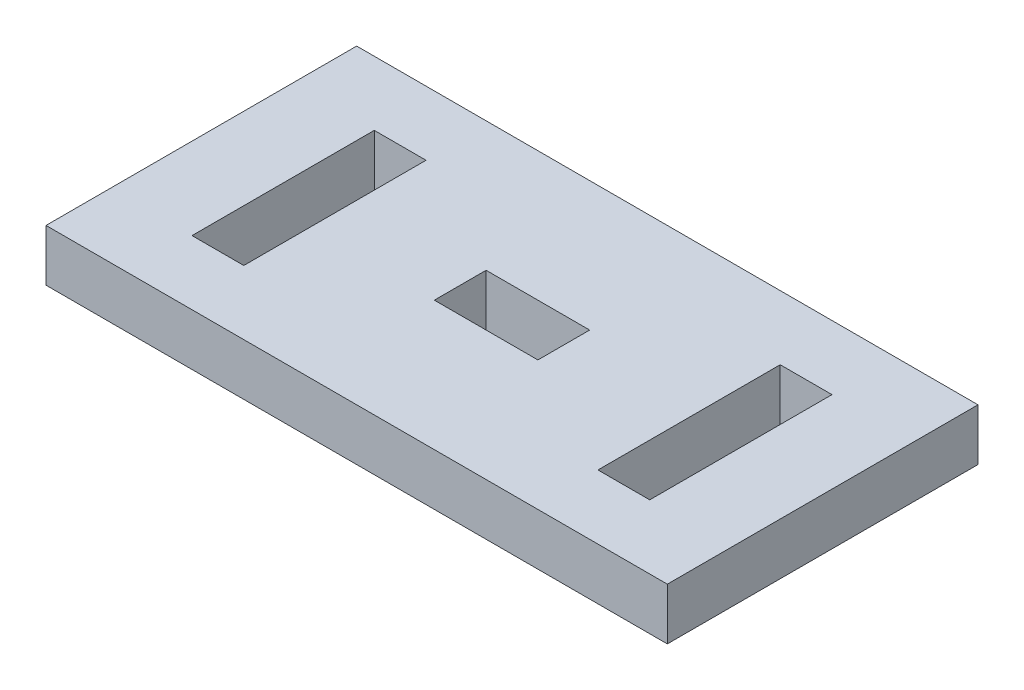
ISO-10303-21;
HEADER;
FILE_DESCRIPTION(('STEP AP214'),'2;1');
FILE_NAME('part.step','',(''),(''),'','','');
FILE_SCHEMA(('AUTOMOTIVE_DESIGN { 1 0 10303 214 1 1 1 1 }'));
ENDSEC;
DATA;
#1=APPLICATION_CONTEXT('core data for automotive mechanical design processes');
#2=APPLICATION_PROTOCOL_DEFINITION('international standard','automotive_design',2000,#1);
#3=PRODUCT_CONTEXT('',#1,'mechanical');
#4=PRODUCT('Part','Part','',(#3));
#5=PRODUCT_RELATED_PRODUCT_CATEGORY('part','',(#4));
#6=PRODUCT_DEFINITION_FORMATION('','',#4);
#7=PRODUCT_DEFINITION_CONTEXT('part definition',#1,'design');
#8=PRODUCT_DEFINITION('design','',#6,#7);
#9=PRODUCT_DEFINITION_SHAPE('','',#8);
#10=(LENGTH_UNIT() NAMED_UNIT(*) SI_UNIT(.MILLI.,.METRE.));
#11=(NAMED_UNIT(*) PLANE_ANGLE_UNIT() SI_UNIT($,.RADIAN.));
#12=(NAMED_UNIT(*) SI_UNIT($,.STERADIAN.) SOLID_ANGLE_UNIT());
#13=UNCERTAINTY_MEASURE_WITH_UNIT(LENGTH_MEASURE(1.E-05),#10,'distance_accuracy_value','');
#14=(GEOMETRIC_REPRESENTATION_CONTEXT(3) GLOBAL_UNCERTAINTY_ASSIGNED_CONTEXT((#13)) GLOBAL_UNIT_ASSIGNED_CONTEXT((#10,
#11,#12)) REPRESENTATION_CONTEXT('',''));
#15=CARTESIAN_POINT('',(0.,0.,0.));
#16=DIRECTION('',(0.,0.,1.));
#17=DIRECTION('',(1.,0.,0.));
#18=AXIS2_PLACEMENT_3D('',#15,#16,#17);
#19=CARTESIAN_POINT('',(0.,6.35,0.));
#20=DIRECTION('',(0.,-1.,0.));
#21=DIRECTION('',(0.,0.,-1.));
#22=AXIS2_PLACEMENT_3D('',#19,#20,#21);
#23=PLANE('',#22);
#24=DIRECTION('',(0.,0.,-1.));
#25=VECTOR('',#24,1.);
#26=CARTESIAN_POINT('',(66.167,6.35,-30.226));
#27=LINE('',#26,#25);
#28=CARTESIAN_POINT('',(66.167,6.35,-7.87400000000001));
#29=VERTEX_POINT('',#28);
#30=CARTESIAN_POINT('',(66.167,6.35,-30.226));
#31=VERTEX_POINT('',#30);
#32=EDGE_CURVE('E182',#29,#31,#27,.T.);
#33=ORIENTED_EDGE('',*,*,#32,.F.);
#34=DIRECTION('',(1.,0.,0.));
#35=VECTOR('',#34,1.);
#36=CARTESIAN_POINT('',(66.167,6.35,-7.87400000000001));
#37=LINE('',#36,#35);
#38=CARTESIAN_POINT('',(59.817,6.35,-7.87400000000001));
#39=VERTEX_POINT('',#38);
#40=EDGE_CURVE('E190',#39,#29,#37,.T.);
#41=ORIENTED_EDGE('',*,*,#40,.F.);
#42=DIRECTION('',(0.,0.,1.));
#43=VECTOR('',#42,1.);
#44=CARTESIAN_POINT('',(59.817,6.35,-30.226));
#45=LINE('',#44,#43);
#46=CARTESIAN_POINT('',(59.817,6.35,-30.226));
#47=VERTEX_POINT('',#46);
#48=EDGE_CURVE('E187',#47,#39,#45,.T.);
#49=ORIENTED_EDGE('',*,*,#48,.F.);
#50=DIRECTION('',(-1.,0.,0.));
#51=VECTOR('',#50,1.);
#52=CARTESIAN_POINT('',(66.167,6.35,-30.226));
#53=LINE('',#52,#51);
#54=EDGE_CURVE('E184',#31,#47,#53,.T.);
#55=ORIENTED_EDGE('',*,*,#54,.F.);
#56=EDGE_LOOP('',(#33,#41,#49,#55));
#57=FACE_BOUND('',#56,.T.);
#58=DIRECTION('',(0.,0.,1.));
#59=VECTOR('',#58,1.);
#60=CARTESIAN_POINT('',(0.,6.35,0.));
#61=LINE('',#60,#59);
#62=CARTESIAN_POINT('',(0.,6.35,-38.1));
#63=VERTEX_POINT('',#62);
#64=CARTESIAN_POINT('',(0.,6.35,0.));
#65=VERTEX_POINT('',#64);
#66=EDGE_CURVE('E244',#63,#65,#61,.T.);
#67=ORIENTED_EDGE('',*,*,#66,.T.);
#68=DIRECTION('',(1.,0.,0.));
#69=VECTOR('',#68,1.);
#70=CARTESIAN_POINT('',(0.,6.35,0.));
#71=LINE('',#70,#69);
#72=CARTESIAN_POINT('',(76.2,6.35,0.));
#73=VERTEX_POINT('',#72);
#74=EDGE_CURVE('E247',#65,#73,#71,.T.);
#75=ORIENTED_EDGE('',*,*,#74,.T.);
#76=DIRECTION('',(0.,0.,-1.));
#77=VECTOR('',#76,1.);
#78=CARTESIAN_POINT('',(76.2,6.35,0.));
#79=LINE('',#78,#77);
#80=CARTESIAN_POINT('',(76.2,6.35,-38.1));
#81=VERTEX_POINT('',#80);
#82=EDGE_CURVE('E250',#73,#81,#79,.T.);
#83=ORIENTED_EDGE('',*,*,#82,.T.);
#84=DIRECTION('',(-1.,0.,0.));
#85=VECTOR('',#84,1.);
#86=CARTESIAN_POINT('',(0.,6.35,-38.1));
#87=LINE('',#86,#85);
#88=EDGE_CURVE('E252',#81,#63,#87,.T.);
#89=ORIENTED_EDGE('',*,*,#88,.T.);
#90=EDGE_LOOP('',(#67,#75,#83,#89));
#91=FACE_BOUND('',#90,.T.);
#92=DIRECTION('',(-1.,0.,0.));
#93=VECTOR('',#92,1.);
#94=CARTESIAN_POINT('',(10.033,6.35,-30.226));
#95=LINE('',#94,#93);
#96=CARTESIAN_POINT('',(16.383,6.35,-30.226));
#97=VERTEX_POINT('',#96);
#98=CARTESIAN_POINT('',(10.033,6.35,-30.226));
#99=VERTEX_POINT('',#98);
#100=EDGE_CURVE('E213',#97,#99,#95,.T.);
#101=ORIENTED_EDGE('',*,*,#100,.F.);
#102=DIRECTION('',(0.,0.,-1.));
#103=VECTOR('',#102,1.);
#104=CARTESIAN_POINT('',(16.383,6.35,-30.226));
#105=LINE('',#104,#103);
#106=CARTESIAN_POINT('',(16.383,6.35,-7.874));
#107=VERTEX_POINT('',#106);
#108=EDGE_CURVE('E221',#107,#97,#105,.T.);
#109=ORIENTED_EDGE('',*,*,#108,.F.);
#110=DIRECTION('',(1.,0.,0.));
#111=VECTOR('',#110,1.);
#112=CARTESIAN_POINT('',(10.033,6.35,-7.87400000000001));
#113=LINE('',#112,#111);
#114=CARTESIAN_POINT('',(10.033,6.35,-7.87400000000001));
#115=VERTEX_POINT('',#114);
#116=EDGE_CURVE('E218',#115,#107,#113,.T.);
#117=ORIENTED_EDGE('',*,*,#116,.F.);
#118=DIRECTION('',(0.,0.,1.));
#119=VECTOR('',#118,1.);
#120=CARTESIAN_POINT('',(10.033,6.35,-30.226));
#121=LINE('',#120,#119);
#122=EDGE_CURVE('E215',#99,#115,#121,.T.);
#123=ORIENTED_EDGE('',*,*,#122,.F.);
#124=EDGE_LOOP('',(#101,#109,#117,#123));
#125=FACE_BOUND('',#124,.T.);
#126=DIRECTION('',(0.,0.,-1.));
#127=VECTOR('',#126,1.);
#128=CARTESIAN_POINT('',(44.45,6.35,-15.875));
#129=LINE('',#128,#127);
#130=CARTESIAN_POINT('',(44.45,6.35,-15.875));
#131=VERTEX_POINT('',#130);
#132=CARTESIAN_POINT('',(44.45,6.35,-22.225));
#133=VERTEX_POINT('',#132);
#134=EDGE_CURVE('E146',#131,#133,#129,.T.);
#135=ORIENTED_EDGE('',*,*,#134,.F.);
#136=DIRECTION('',(1.,0.,0.));
#137=VECTOR('',#136,1.);
#138=CARTESIAN_POINT('',(31.75,6.35,-15.875));
#139=LINE('',#138,#137);
#140=CARTESIAN_POINT('',(31.75,6.35,-15.875));
#141=VERTEX_POINT('',#140);
#142=EDGE_CURVE('E168',#141,#131,#139,.T.);
#143=ORIENTED_EDGE('',*,*,#142,.F.);
#144=DIRECTION('',(0.,0.,1.));
#145=VECTOR('',#144,1.);
#146=CARTESIAN_POINT('',(31.75,6.35,-15.875));
#147=LINE('',#146,#145);
#148=CARTESIAN_POINT('',(31.75,6.35,-22.225));
#149=VERTEX_POINT('',#148);
#150=EDGE_CURVE('E166',#149,#141,#147,.T.);
#151=ORIENTED_EDGE('',*,*,#150,.F.);
#152=DIRECTION('',(-1.,0.,0.));
#153=VECTOR('',#152,1.);
#154=CARTESIAN_POINT('',(31.75,6.35,-22.225));
#155=LINE('',#154,#153);
#156=EDGE_CURVE('E154',#133,#149,#155,.T.);
#157=ORIENTED_EDGE('',*,*,#156,.F.);
#158=EDGE_LOOP('',(#135,#143,#151,#157));
#159=FACE_BOUND('',#158,.T.);
#160=ADVANCED_FACE('F33',(#57,#91,#125,#159),#23,.F.);
#161=CARTESIAN_POINT('',(0.,0.,0.));
#162=DIRECTION('',(0.,-1.,0.));
#163=DIRECTION('',(0.,0.,-1.));
#164=AXIS2_PLACEMENT_3D('',#161,#162,#163);
#165=PLANE('',#164);
#166=DIRECTION('',(0.,0.,1.));
#167=VECTOR('',#166,1.);
#168=CARTESIAN_POINT('',(0.,0.,0.));
#169=LINE('',#168,#167);
#170=CARTESIAN_POINT('',(0.,0.,-38.1));
#171=VERTEX_POINT('',#170);
#172=CARTESIAN_POINT('',(0.,0.,0.));
#173=VERTEX_POINT('',#172);
#174=EDGE_CURVE('E243',#171,#173,#169,.T.);
#175=ORIENTED_EDGE('',*,*,#174,.F.);
#176=DIRECTION('',(-1.,0.,0.));
#177=VECTOR('',#176,1.);
#178=CARTESIAN_POINT('',(0.,0.,-38.1));
#179=LINE('',#178,#177);
#180=CARTESIAN_POINT('',(76.2,0.,-38.1));
#181=VERTEX_POINT('',#180);
#182=EDGE_CURVE('E248',#181,#171,#179,.T.);
#183=ORIENTED_EDGE('',*,*,#182,.F.);
#184=DIRECTION('',(0.,0.,-1.));
#185=VECTOR('',#184,1.);
#186=CARTESIAN_POINT('',(76.2,0.,0.));
#187=LINE('',#186,#185);
#188=CARTESIAN_POINT('',(76.2,0.,0.));
#189=VERTEX_POINT('',#188);
#190=EDGE_CURVE('E259',#189,#181,#187,.T.);
#191=ORIENTED_EDGE('',*,*,#190,.F.);
#192=DIRECTION('',(1.,0.,0.));
#193=VECTOR('',#192,1.);
#194=CARTESIAN_POINT('',(0.,0.,0.));
#195=LINE('',#194,#193);
#196=EDGE_CURVE('E257',#173,#189,#195,.T.);
#197=ORIENTED_EDGE('',*,*,#196,.F.);
#198=EDGE_LOOP('',(#175,#183,#191,#197));
#199=FACE_BOUND('',#198,.T.);
#200=DIRECTION('',(0.,0.,-1.));
#201=VECTOR('',#200,1.);
#202=CARTESIAN_POINT('',(16.383,0.,-30.226));
#203=LINE('',#202,#201);
#204=CARTESIAN_POINT('',(16.383,0.,-7.874));
#205=VERTEX_POINT('',#204);
#206=CARTESIAN_POINT('',(16.383,0.,-30.226));
#207=VERTEX_POINT('',#206);
#208=EDGE_CURVE('E216',#205,#207,#203,.T.);
#209=ORIENTED_EDGE('',*,*,#208,.T.);
#210=DIRECTION('',(-1.,0.,0.));
#211=VECTOR('',#210,1.);
#212=CARTESIAN_POINT('',(10.033,0.,-30.226));
#213=LINE('',#212,#211);
#214=CARTESIAN_POINT('',(10.033,0.,-30.226));
#215=VERTEX_POINT('',#214);
#216=EDGE_CURVE('E212',#207,#215,#213,.T.);
#217=ORIENTED_EDGE('',*,*,#216,.T.);
#218=DIRECTION('',(0.,0.,1.));
#219=VECTOR('',#218,1.);
#220=CARTESIAN_POINT('',(10.033,0.,-30.226));
#221=LINE('',#220,#219);
#222=CARTESIAN_POINT('',(10.033,0.,-7.87400000000001));
#223=VERTEX_POINT('',#222);
#224=EDGE_CURVE('E226',#215,#223,#221,.T.);
#225=ORIENTED_EDGE('',*,*,#224,.T.);
#226=DIRECTION('',(1.,0.,0.));
#227=VECTOR('',#226,1.);
#228=CARTESIAN_POINT('',(10.033,0.,-7.87400000000001));
#229=LINE('',#228,#227);
#230=EDGE_CURVE('E229',#223,#205,#229,.T.);
#231=ORIENTED_EDGE('',*,*,#230,.T.);
#232=EDGE_LOOP('',(#209,#217,#225,#231));
#233=FACE_BOUND('',#232,.T.);
#234=DIRECTION('',(1.,0.,0.));
#235=VECTOR('',#234,1.);
#236=CARTESIAN_POINT('',(66.167,0.,-7.87400000000001));
#237=LINE('',#236,#235);
#238=CARTESIAN_POINT('',(59.817,0.,-7.87400000000001));
#239=VERTEX_POINT('',#238);
#240=CARTESIAN_POINT('',(66.167,0.,-7.87400000000001));
#241=VERTEX_POINT('',#240);
#242=EDGE_CURVE('E185',#239,#241,#237,.T.);
#243=ORIENTED_EDGE('',*,*,#242,.T.);
#244=DIRECTION('',(0.,0.,-1.));
#245=VECTOR('',#244,1.);
#246=CARTESIAN_POINT('',(66.167,0.,-30.226));
#247=LINE('',#246,#245);
#248=CARTESIAN_POINT('',(66.167,0.,-30.226));
#249=VERTEX_POINT('',#248);
#250=EDGE_CURVE('E162',#241,#249,#247,.T.);
#251=ORIENTED_EDGE('',*,*,#250,.T.);
#252=DIRECTION('',(-1.,0.,0.));
#253=VECTOR('',#252,1.);
#254=CARTESIAN_POINT('',(66.167,0.,-30.226));
#255=LINE('',#254,#253);
#256=CARTESIAN_POINT('',(59.817,0.,-30.226));
#257=VERTEX_POINT('',#256);
#258=EDGE_CURVE('E195',#249,#257,#255,.T.);
#259=ORIENTED_EDGE('',*,*,#258,.T.);
#260=DIRECTION('',(0.,0.,1.));
#261=VECTOR('',#260,1.);
#262=CARTESIAN_POINT('',(59.817,0.,-30.226));
#263=LINE('',#262,#261);
#264=EDGE_CURVE('E198',#257,#239,#263,.T.);
#265=ORIENTED_EDGE('',*,*,#264,.T.);
#266=EDGE_LOOP('',(#243,#251,#259,#265));
#267=FACE_BOUND('',#266,.T.);
#268=DIRECTION('',(1.,0.,0.));
#269=VECTOR('',#268,1.);
#270=CARTESIAN_POINT('',(31.75,0.,-15.875));
#271=LINE('',#270,#269);
#272=CARTESIAN_POINT('',(31.75,0.,-15.875));
#273=VERTEX_POINT('',#272);
#274=CARTESIAN_POINT('',(44.45,0.,-15.875));
#275=VERTEX_POINT('',#274);
#276=EDGE_CURVE('E155',#273,#275,#271,.T.);
#277=ORIENTED_EDGE('',*,*,#276,.T.);
#278=DIRECTION('',(0.,0.,-1.));
#279=VECTOR('',#278,1.);
#280=CARTESIAN_POINT('',(44.45,0.,-15.875));
#281=LINE('',#280,#279);
#282=CARTESIAN_POINT('',(44.45,0.,-22.225));
#283=VERTEX_POINT('',#282);
#284=EDGE_CURVE('E56',#275,#283,#281,.T.);
#285=ORIENTED_EDGE('',*,*,#284,.T.);
#286=DIRECTION('',(-1.,0.,0.));
#287=VECTOR('',#286,1.);
#288=CARTESIAN_POINT('',(31.75,0.,-22.225));
#289=LINE('',#288,#287);
#290=CARTESIAN_POINT('',(31.75,0.,-22.225));
#291=VERTEX_POINT('',#290);
#292=EDGE_CURVE('E161',#283,#291,#289,.T.);
#293=ORIENTED_EDGE('',*,*,#292,.T.);
#294=DIRECTION('',(0.,0.,1.));
#295=VECTOR('',#294,1.);
#296=CARTESIAN_POINT('',(31.75,0.,-15.875));
#297=LINE('',#296,#295);
#298=EDGE_CURVE('E174',#291,#273,#297,.T.);
#299=ORIENTED_EDGE('',*,*,#298,.T.);
#300=EDGE_LOOP('',(#277,#285,#293,#299));
#301=FACE_BOUND('',#300,.T.);
#302=ADVANCED_FACE('F277',(#199,#233,#267,#301),#165,.T.);
#303=CARTESIAN_POINT('',(0.,6.35,0.));
#304=DIRECTION('',(1.,0.,0.));
#305=DIRECTION('',(0.,0.,-1.));
#306=AXIS2_PLACEMENT_3D('',#303,#304,#305);
#307=PLANE('',#306);
#308=ORIENTED_EDGE('',*,*,#174,.T.);
#309=DIRECTION('',(0.,-1.,0.));
#310=VECTOR('',#309,1.);
#311=CARTESIAN_POINT('',(0.,6.35,0.));
#312=LINE('',#311,#310);
#313=EDGE_CURVE('E11',#65,#173,#312,.T.);
#314=ORIENTED_EDGE('',*,*,#313,.F.);
#315=ORIENTED_EDGE('',*,*,#66,.F.);
#316=DIRECTION('',(0.,-1.,0.));
#317=VECTOR('',#316,1.);
#318=CARTESIAN_POINT('',(0.,6.35,-38.1));
#319=LINE('',#318,#317);
#320=EDGE_CURVE('E254',#63,#171,#319,.T.);
#321=ORIENTED_EDGE('',*,*,#320,.T.);
#322=EDGE_LOOP('',(#308,#314,#315,#321));
#323=FACE_BOUND('',#322,.T.);
#324=ADVANCED_FACE('F35',(#323),#307,.F.);
#325=CARTESIAN_POINT('',(0.,6.35,0.));
#326=DIRECTION('',(0.,0.,-1.));
#327=DIRECTION('',(-1.,0.,0.));
#328=AXIS2_PLACEMENT_3D('',#325,#326,#327);
#329=PLANE('',#328);
#330=ORIENTED_EDGE('',*,*,#196,.T.);
#331=DIRECTION('',(0.,-1.,0.));
#332=VECTOR('',#331,1.);
#333=CARTESIAN_POINT('',(76.2,6.35,0.));
#334=LINE('',#333,#332);
#335=EDGE_CURVE('E41',#73,#189,#334,.T.);
#336=ORIENTED_EDGE('',*,*,#335,.F.);
#337=ORIENTED_EDGE('',*,*,#74,.F.);
#338=ORIENTED_EDGE('',*,*,#313,.T.);
#339=EDGE_LOOP('',(#330,#336,#337,#338));
#340=FACE_BOUND('',#339,.T.);
#341=ADVANCED_FACE('F288',(#340),#329,.F.);
#342=CARTESIAN_POINT('',(76.2,6.35,0.));
#343=DIRECTION('',(-1.,0.,0.));
#344=DIRECTION('',(0.,0.,1.));
#345=AXIS2_PLACEMENT_3D('',#342,#343,#344);
#346=PLANE('',#345);
#347=ORIENTED_EDGE('',*,*,#190,.T.);
#348=DIRECTION('',(0.,-1.,0.));
#349=VECTOR('',#348,1.);
#350=CARTESIAN_POINT('',(76.2,6.35,-38.1));
#351=LINE('',#350,#349);
#352=EDGE_CURVE('E264',#81,#181,#351,.T.);
#353=ORIENTED_EDGE('',*,*,#352,.F.);
#354=ORIENTED_EDGE('',*,*,#82,.F.);
#355=ORIENTED_EDGE('',*,*,#335,.T.);
#356=EDGE_LOOP('',(#347,#353,#354,#355));
#357=FACE_BOUND('',#356,.T.);
#358=ADVANCED_FACE('F271',(#357),#346,.F.);
#359=CARTESIAN_POINT('',(0.,6.35,-38.1));
#360=DIRECTION('',(0.,0.,1.));
#361=DIRECTION('',(1.,0.,0.));
#362=AXIS2_PLACEMENT_3D('',#359,#360,#361);
#363=PLANE('',#362);
#364=ORIENTED_EDGE('',*,*,#182,.T.);
#365=ORIENTED_EDGE('',*,*,#320,.F.);
#366=ORIENTED_EDGE('',*,*,#88,.F.);
#367=ORIENTED_EDGE('',*,*,#352,.T.);
#368=EDGE_LOOP('',(#364,#365,#366,#367));
#369=FACE_BOUND('',#368,.T.);
#370=ADVANCED_FACE('F281',(#369),#363,.F.);
#371=CARTESIAN_POINT('',(10.033,6.35,-30.226));
#372=DIRECTION('',(0.,0.,1.));
#373=DIRECTION('',(1.,0.,0.));
#374=AXIS2_PLACEMENT_3D('',#371,#372,#373);
#375=PLANE('',#374);
#376=ORIENTED_EDGE('',*,*,#216,.F.);
#377=DIRECTION('',(0.,-1.,0.));
#378=VECTOR('',#377,1.);
#379=CARTESIAN_POINT('',(16.383,6.35,-30.226));
#380=LINE('',#379,#378);
#381=EDGE_CURVE('E223',#97,#207,#380,.T.);
#382=ORIENTED_EDGE('',*,*,#381,.F.);
#383=ORIENTED_EDGE('',*,*,#100,.T.);
#384=DIRECTION('',(0.,-1.,0.));
#385=VECTOR('',#384,1.);
#386=CARTESIAN_POINT('',(10.033,6.35,-30.226));
#387=LINE('',#386,#385);
#388=EDGE_CURVE('E240',#99,#215,#387,.T.);
#389=ORIENTED_EDGE('',*,*,#388,.T.);
#390=EDGE_LOOP('',(#376,#382,#383,#389));
#391=FACE_BOUND('',#390,.T.);
#392=ADVANCED_FACE('F304',(#391),#375,.T.);
#393=CARTESIAN_POINT('',(10.033,6.35,-30.226));
#394=DIRECTION('',(1.,0.,0.));
#395=DIRECTION('',(0.,0.,-1.));
#396=AXIS2_PLACEMENT_3D('',#393,#394,#395);
#397=PLANE('',#396);
#398=ORIENTED_EDGE('',*,*,#224,.F.);
#399=ORIENTED_EDGE('',*,*,#388,.F.);
#400=ORIENTED_EDGE('',*,*,#122,.T.);
#401=DIRECTION('',(0.,-1.,0.));
#402=VECTOR('',#401,1.);
#403=CARTESIAN_POINT('',(10.033,6.35,-7.87400000000001));
#404=LINE('',#403,#402);
#405=EDGE_CURVE('E238',#115,#223,#404,.T.);
#406=ORIENTED_EDGE('',*,*,#405,.T.);
#407=EDGE_LOOP('',(#398,#399,#400,#406));
#408=FACE_BOUND('',#407,.T.);
#409=ADVANCED_FACE('F311',(#408),#397,.T.);
#410=CARTESIAN_POINT('',(10.033,6.35,-7.87400000000001));
#411=DIRECTION('',(0.,0.,-1.));
#412=DIRECTION('',(-1.,0.,0.));
#413=AXIS2_PLACEMENT_3D('',#410,#411,#412);
#414=PLANE('',#413);
#415=ORIENTED_EDGE('',*,*,#230,.F.);
#416=ORIENTED_EDGE('',*,*,#405,.F.);
#417=ORIENTED_EDGE('',*,*,#116,.T.);
#418=DIRECTION('',(0.,-1.,0.));
#419=VECTOR('',#418,1.);
#420=CARTESIAN_POINT('',(16.383,6.35,-7.874));
#421=LINE('',#420,#419);
#422=EDGE_CURVE('E236',#107,#205,#421,.T.);
#423=ORIENTED_EDGE('',*,*,#422,.T.);
#424=EDGE_LOOP('',(#415,#416,#417,#423));
#425=FACE_BOUND('',#424,.T.);
#426=ADVANCED_FACE('F316',(#425),#414,.T.);
#427=CARTESIAN_POINT('',(16.383,6.35,-30.226));
#428=DIRECTION('',(-1.,0.,0.));
#429=DIRECTION('',(0.,0.,1.));
#430=AXIS2_PLACEMENT_3D('',#427,#428,#429);
#431=PLANE('',#430);
#432=ORIENTED_EDGE('',*,*,#208,.F.);
#433=ORIENTED_EDGE('',*,*,#422,.F.);
#434=ORIENTED_EDGE('',*,*,#108,.T.);
#435=ORIENTED_EDGE('',*,*,#381,.T.);
#436=EDGE_LOOP('',(#432,#433,#434,#435));
#437=FACE_BOUND('',#436,.T.);
#438=ADVANCED_FACE('F323',(#437),#431,.T.);
#439=CARTESIAN_POINT('',(66.167,6.35,-30.226));
#440=DIRECTION('',(-1.,0.,0.));
#441=DIRECTION('',(0.,0.,1.));
#442=AXIS2_PLACEMENT_3D('',#439,#440,#441);
#443=PLANE('',#442);
#444=ORIENTED_EDGE('',*,*,#250,.F.);
#445=DIRECTION('',(0.,-1.,0.));
#446=VECTOR('',#445,1.);
#447=CARTESIAN_POINT('',(66.167,6.35,-7.87400000000001));
#448=LINE('',#447,#446);
#449=EDGE_CURVE('E192',#29,#241,#448,.T.);
#450=ORIENTED_EDGE('',*,*,#449,.F.);
#451=ORIENTED_EDGE('',*,*,#32,.T.);
#452=DIRECTION('',(0.,-1.,0.));
#453=VECTOR('',#452,1.);
#454=CARTESIAN_POINT('',(66.167,6.35,-30.226));
#455=LINE('',#454,#453);
#456=EDGE_CURVE('E209',#31,#249,#455,.T.);
#457=ORIENTED_EDGE('',*,*,#456,.T.);
#458=EDGE_LOOP('',(#444,#450,#451,#457));
#459=FACE_BOUND('',#458,.T.);
#460=ADVANCED_FACE('F336',(#459),#443,.T.);
#461=CARTESIAN_POINT('',(66.167,6.35,-30.226));
#462=DIRECTION('',(0.,0.,1.));
#463=DIRECTION('',(1.,0.,0.));
#464=AXIS2_PLACEMENT_3D('',#461,#462,#463);
#465=PLANE('',#464);
#466=ORIENTED_EDGE('',*,*,#258,.F.);
#467=ORIENTED_EDGE('',*,*,#456,.F.);
#468=ORIENTED_EDGE('',*,*,#54,.T.);
#469=DIRECTION('',(0.,-1.,0.));
#470=VECTOR('',#469,1.);
#471=CARTESIAN_POINT('',(59.817,6.35,-30.226));
#472=LINE('',#471,#470);
#473=EDGE_CURVE('E207',#47,#257,#472,.T.);
#474=ORIENTED_EDGE('',*,*,#473,.T.);
#475=EDGE_LOOP('',(#466,#467,#468,#474));
#476=FACE_BOUND('',#475,.T.);
#477=ADVANCED_FACE('F341',(#476),#465,.T.);
#478=CARTESIAN_POINT('',(59.817,6.35,-30.226));
#479=DIRECTION('',(1.,0.,0.));
#480=DIRECTION('',(0.,0.,-1.));
#481=AXIS2_PLACEMENT_3D('',#478,#479,#480);
#482=PLANE('',#481);
#483=ORIENTED_EDGE('',*,*,#264,.F.);
#484=ORIENTED_EDGE('',*,*,#473,.F.);
#485=ORIENTED_EDGE('',*,*,#48,.T.);
#486=DIRECTION('',(0.,-1.,0.));
#487=VECTOR('',#486,1.);
#488=CARTESIAN_POINT('',(59.817,6.35,-7.87400000000001));
#489=LINE('',#488,#487);
#490=EDGE_CURVE('E205',#39,#239,#489,.T.);
#491=ORIENTED_EDGE('',*,*,#490,.T.);
#492=EDGE_LOOP('',(#483,#484,#485,#491));
#493=FACE_BOUND('',#492,.T.);
#494=ADVANCED_FACE('F345',(#493),#482,.T.);
#495=CARTESIAN_POINT('',(66.167,6.35,-7.87400000000001));
#496=DIRECTION('',(0.,0.,-1.));
#497=DIRECTION('',(-1.,0.,0.));
#498=AXIS2_PLACEMENT_3D('',#495,#496,#497);
#499=PLANE('',#498);
#500=ORIENTED_EDGE('',*,*,#242,.F.);
#501=ORIENTED_EDGE('',*,*,#490,.F.);
#502=ORIENTED_EDGE('',*,*,#40,.T.);
#503=ORIENTED_EDGE('',*,*,#449,.T.);
#504=EDGE_LOOP('',(#500,#501,#502,#503));
#505=FACE_BOUND('',#504,.T.);
#506=ADVANCED_FACE('F349',(#505),#499,.T.);
#507=CARTESIAN_POINT('',(44.45,6.35,-15.875));
#508=DIRECTION('',(-1.,0.,0.));
#509=DIRECTION('',(0.,0.,1.));
#510=AXIS2_PLACEMENT_3D('',#507,#508,#509);
#511=PLANE('',#510);
#512=ORIENTED_EDGE('',*,*,#284,.F.);
#513=DIRECTION('',(0.,-1.,0.));
#514=VECTOR('',#513,1.);
#515=CARTESIAN_POINT('',(44.45,6.35,-15.875));
#516=LINE('',#515,#514);
#517=EDGE_CURVE('E150',#131,#275,#516,.T.);
#518=ORIENTED_EDGE('',*,*,#517,.F.);
#519=ORIENTED_EDGE('',*,*,#134,.T.);
#520=DIRECTION('',(0.,-1.,0.));
#521=VECTOR('',#520,1.);
#522=CARTESIAN_POINT('',(44.45,6.35,-22.225));
#523=LINE('',#522,#521);
#524=EDGE_CURVE('E149',#133,#283,#523,.T.);
#525=ORIENTED_EDGE('',*,*,#524,.T.);
#526=EDGE_LOOP('',(#512,#518,#519,#525));
#527=FACE_BOUND('',#526,.T.);
#528=ADVANCED_FACE('F148',(#527),#511,.T.);
#529=CARTESIAN_POINT('',(31.75,6.35,-22.225));
#530=DIRECTION('',(0.,0.,1.));
#531=DIRECTION('',(1.,0.,0.));
#532=AXIS2_PLACEMENT_3D('',#529,#530,#531);
#533=PLANE('',#532);
#534=ORIENTED_EDGE('',*,*,#292,.F.);
#535=ORIENTED_EDGE('',*,*,#524,.F.);
#536=ORIENTED_EDGE('',*,*,#156,.T.);
#537=DIRECTION('',(0.,-1.,0.));
#538=VECTOR('',#537,1.);
#539=CARTESIAN_POINT('',(31.75,6.35,-22.225));
#540=LINE('',#539,#538);
#541=EDGE_CURVE('E163',#149,#291,#540,.T.);
#542=ORIENTED_EDGE('',*,*,#541,.T.);
#543=EDGE_LOOP('',(#534,#535,#536,#542));
#544=FACE_BOUND('',#543,.T.);
#545=ADVANCED_FACE('F158',(#544),#533,.T.);
#546=CARTESIAN_POINT('',(31.75,6.35,-15.875));
#547=DIRECTION('',(1.,0.,0.));
#548=DIRECTION('',(0.,0.,-1.));
#549=AXIS2_PLACEMENT_3D('',#546,#547,#548);
#550=PLANE('',#549);
#551=ORIENTED_EDGE('',*,*,#298,.F.);
#552=ORIENTED_EDGE('',*,*,#541,.F.);
#553=ORIENTED_EDGE('',*,*,#150,.T.);
#554=DIRECTION('',(0.,-1.,0.));
#555=VECTOR('',#554,1.);
#556=CARTESIAN_POINT('',(31.75,6.35,-15.875));
#557=LINE('',#556,#555);
#558=EDGE_CURVE('E48',#141,#273,#557,.T.);
#559=ORIENTED_EDGE('',*,*,#558,.T.);
#560=EDGE_LOOP('',(#551,#552,#553,#559));
#561=FACE_BOUND('',#560,.T.);
#562=ADVANCED_FACE('F358',(#561),#550,.T.);
#563=CARTESIAN_POINT('',(31.75,6.35,-15.875));
#564=DIRECTION('',(0.,0.,-1.));
#565=DIRECTION('',(-1.,0.,0.));
#566=AXIS2_PLACEMENT_3D('',#563,#564,#565);
#567=PLANE('',#566);
#568=ORIENTED_EDGE('',*,*,#276,.F.);
#569=ORIENTED_EDGE('',*,*,#558,.F.);
#570=ORIENTED_EDGE('',*,*,#142,.T.);
#571=ORIENTED_EDGE('',*,*,#517,.T.);
#572=EDGE_LOOP('',(#568,#569,#570,#571));
#573=FACE_BOUND('',#572,.T.);
#574=ADVANCED_FACE('F361',(#573),#567,.T.);
#575=CLOSED_SHELL('',(#160,#302,#324,#341,#358,#370,#392,#409,#426,#438,#460,#477,#494,#506,
#528,#545,#562,#574));
#576=MANIFOLD_SOLID_BREP('B2',#575);
#577=ADVANCED_BREP_SHAPE_REPRESENTATION('',(#18,#576),#14);
#578=SHAPE_DEFINITION_REPRESENTATION(#9,#577);
ENDSEC;
END-ISO-10303-21;
